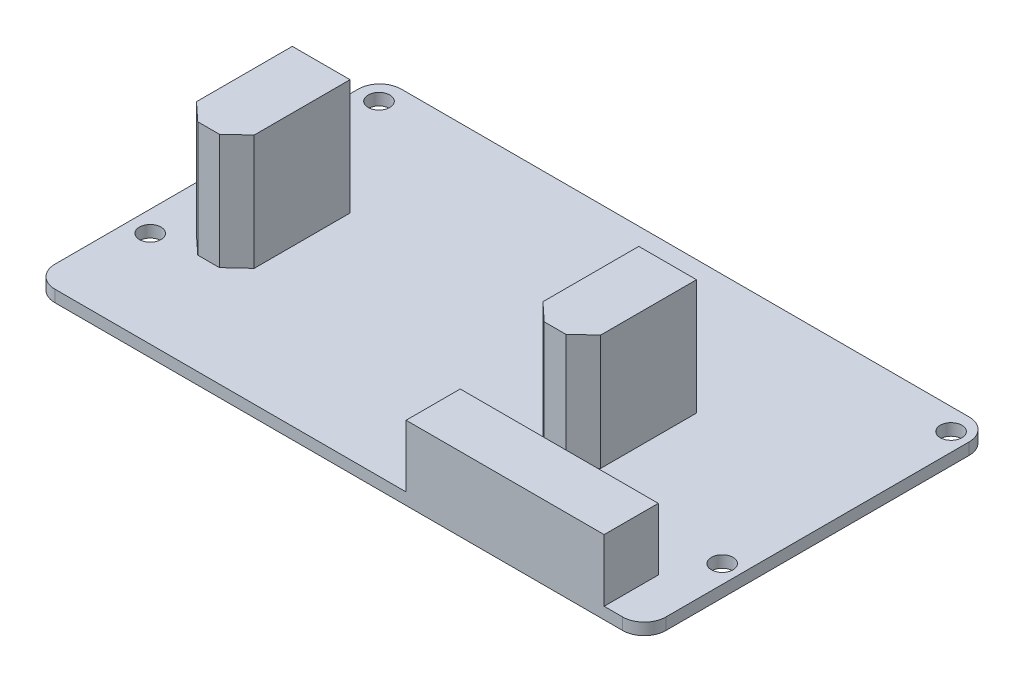
ISO-10303-21;
HEADER;
FILE_DESCRIPTION(('STEP AP214'),'2;1');
FILE_NAME('part.step','',(''),(''),'','','');
FILE_SCHEMA(('AUTOMOTIVE_DESIGN { 1 0 10303 214 1 1 1 1 }'));
ENDSEC;
DATA;
#1=APPLICATION_CONTEXT('core data for automotive mechanical design processes');
#2=APPLICATION_PROTOCOL_DEFINITION('international standard','automotive_design',2000,#1);
#3=PRODUCT_CONTEXT('',#1,'mechanical');
#4=PRODUCT('Part','Part','',(#3));
#5=PRODUCT_RELATED_PRODUCT_CATEGORY('part','',(#4));
#6=PRODUCT_DEFINITION_FORMATION('','',#4);
#7=PRODUCT_DEFINITION_CONTEXT('part definition',#1,'design');
#8=PRODUCT_DEFINITION('design','',#6,#7);
#9=PRODUCT_DEFINITION_SHAPE('','',#8);
#10=(LENGTH_UNIT() NAMED_UNIT(*) SI_UNIT(.MILLI.,.METRE.));
#11=(NAMED_UNIT(*) PLANE_ANGLE_UNIT() SI_UNIT($,.RADIAN.));
#12=(NAMED_UNIT(*) SI_UNIT($,.STERADIAN.) SOLID_ANGLE_UNIT());
#13=UNCERTAINTY_MEASURE_WITH_UNIT(LENGTH_MEASURE(1.E-05),#10,'distance_accuracy_value','');
#14=(GEOMETRIC_REPRESENTATION_CONTEXT(3) GLOBAL_UNCERTAINTY_ASSIGNED_CONTEXT((#13)) GLOBAL_UNIT_ASSIGNED_CONTEXT((#10,
#11,#12)) REPRESENTATION_CONTEXT('',''));
#15=CARTESIAN_POINT('',(0.,0.,0.));
#16=DIRECTION('',(0.,0.,1.));
#17=DIRECTION('',(1.,0.,0.));
#18=AXIS2_PLACEMENT_3D('',#15,#16,#17);
#19=CARTESIAN_POINT('',(0.,1.63,0.));
#20=DIRECTION('',(0.,-1.,0.));
#21=DIRECTION('',(0.,0.,-1.));
#22=AXIS2_PLACEMENT_3D('',#19,#20,#21);
#23=PLANE('',#22);
#24=DIRECTION('',(-1.,0.,0.));
#25=VECTOR('',#24,1.);
#26=CARTESIAN_POINT('',(62.31,1.63,-29.58));
#27=LINE('',#26,#25);
#28=CARTESIAN_POINT('',(62.31,1.63,-29.58));
#29=VERTEX_POINT('',#28);
#30=CARTESIAN_POINT('',(54.31,1.63,-29.58));
#31=VERTEX_POINT('',#30);
#32=EDGE_CURVE('E216',#29,#31,#27,.T.);
#33=ORIENTED_EDGE('',*,*,#32,.F.);
#34=DIRECTION('',(0.,0.,-1.));
#35=VECTOR('',#34,1.);
#36=CARTESIAN_POINT('',(62.31,1.63,-29.58));
#37=LINE('',#36,#35);
#38=CARTESIAN_POINT('',(62.31,1.63,-16.3));
#39=VERTEX_POINT('',#38);
#40=EDGE_CURVE('E229',#39,#29,#37,.T.);
#41=ORIENTED_EDGE('',*,*,#40,.F.);
#42=DIRECTION('',(0.73300231256144,0.,-0.680226146057016));
#43=VECTOR('',#42,1.);
#44=CARTESIAN_POINT('',(59.81,1.63,-13.98));
#45=LINE('',#44,#43);
#46=CARTESIAN_POINT('',(59.81,1.63,-13.98));
#47=VERTEX_POINT('',#46);
#48=EDGE_CURVE('E248',#47,#39,#45,.T.);
#49=ORIENTED_EDGE('',*,*,#48,.F.);
#50=DIRECTION('',(1.,0.,0.));
#51=VECTOR('',#50,1.);
#52=CARTESIAN_POINT('',(58.31,1.63,-13.98));
#53=LINE('',#52,#51);
#54=CARTESIAN_POINT('',(56.81,1.63,-13.98));
#55=VERTEX_POINT('',#54);
#56=EDGE_CURVE('E245',#55,#47,#53,.T.);
#57=ORIENTED_EDGE('',*,*,#56,.F.);
#58=DIRECTION('',(0.733002312561439,0.,0.680226146057017));
#59=VECTOR('',#58,1.);
#60=CARTESIAN_POINT('',(56.81,1.63,-13.98));
#61=LINE('',#60,#59);
#62=CARTESIAN_POINT('',(54.31,1.63,-16.3));
#63=VERTEX_POINT('',#62);
#64=EDGE_CURVE('E242',#63,#55,#61,.T.);
#65=ORIENTED_EDGE('',*,*,#64,.F.);
#66=DIRECTION('',(0.,0.,1.));
#67=VECTOR('',#66,1.);
#68=CARTESIAN_POINT('',(54.31,1.63,-29.58));
#69=LINE('',#68,#67);
#70=EDGE_CURVE('E219',#31,#63,#69,.T.);
#71=ORIENTED_EDGE('',*,*,#70,.F.);
#72=EDGE_LOOP('',(#33,#41,#49,#57,#65,#71));
#73=FACE_BOUND('',#72,.T.);
#74=DIRECTION('',(1.,0.,0.));
#75=VECTOR('',#74,1.);
#76=CARTESIAN_POINT('',(84.65,1.63,0.));
#77=LINE('',#76,#75);
#78=CARTESIAN_POINT('',(3.,1.63,0.));
#79=VERTEX_POINT('',#78);
#80=CARTESIAN_POINT('',(51.65,1.63,0.));
#81=VERTEX_POINT('',#80);
#82=EDGE_CURVE('E323',#79,#81,#77,.T.);
#83=ORIENTED_EDGE('',*,*,#82,.T.);
#84=DIRECTION('',(0.,0.,-1.));
#85=VECTOR('',#84,1.);
#86=CARTESIAN_POINT('',(51.65,1.63,0.));
#87=LINE('',#86,#85);
#88=CARTESIAN_POINT('',(51.65,1.63,-7.5));
#89=VERTEX_POINT('',#88);
#90=EDGE_CURVE('E285',#81,#89,#87,.T.);
#91=ORIENTED_EDGE('',*,*,#90,.T.);
#92=DIRECTION('',(-1.,0.,0.));
#93=VECTOR('',#92,1.);
#94=CARTESIAN_POINT('',(79.09,1.63,-7.5));
#95=LINE('',#94,#93);
#96=CARTESIAN_POINT('',(79.09,1.63,-7.5));
#97=VERTEX_POINT('',#96);
#98=EDGE_CURVE('E295',#97,#89,#95,.T.);
#99=ORIENTED_EDGE('',*,*,#98,.F.);
#100=DIRECTION('',(0.,0.,-1.));
#101=VECTOR('',#100,1.);
#102=CARTESIAN_POINT('',(79.09,1.63,0.));
#103=LINE('',#102,#101);
#104=CARTESIAN_POINT('',(79.09,1.63,0.));
#105=VERTEX_POINT('',#104);
#106=EDGE_CURVE('E274',#105,#97,#103,.T.);
#107=ORIENTED_EDGE('',*,*,#106,.F.);
#108=CARTESIAN_POINT('',(81.65,1.63,0.));
#109=VERTEX_POINT('',#108);
#110=EDGE_CURVE('E326',#105,#109,#77,.T.);
#111=ORIENTED_EDGE('',*,*,#110,.T.);
#112=CARTESIAN_POINT('',(81.65,1.63,-3.));
#113=DIRECTION('',(0.,-1.,0.));
#114=DIRECTION('',(0.,0.,-1.));
#115=AXIS2_PLACEMENT_3D('',#112,#113,#114);
#116=CIRCLE('',#115,3.);
#117=CARTESIAN_POINT('',(84.65,1.63,-3.));
#118=VERTEX_POINT('',#117);
#119=EDGE_CURVE('E369',#109,#118,#116,.F.);
#120=ORIENTED_EDGE('',*,*,#119,.T.);
#121=DIRECTION('',(0.,0.,-1.));
#122=VECTOR('',#121,1.);
#123=CARTESIAN_POINT('',(84.65,1.63,-48.));
#124=LINE('',#123,#122);
#125=CARTESIAN_POINT('',(84.65,1.63,-45.));
#126=VERTEX_POINT('',#125);
#127=EDGE_CURVE('E325',#118,#126,#124,.T.);
#128=ORIENTED_EDGE('',*,*,#127,.T.);
#129=CARTESIAN_POINT('',(81.65,1.63,-45.));
#130=DIRECTION('',(0.,-1.,0.));
#131=DIRECTION('',(0.,0.,-1.));
#132=AXIS2_PLACEMENT_3D('',#129,#130,#131);
#133=CIRCLE('',#132,3.);
#134=CARTESIAN_POINT('',(81.65,1.63,-48.));
#135=VERTEX_POINT('',#134);
#136=EDGE_CURVE('E367',#126,#135,#133,.F.);
#137=ORIENTED_EDGE('',*,*,#136,.T.);
#138=DIRECTION('',(-1.,0.,0.));
#139=VECTOR('',#138,1.);
#140=CARTESIAN_POINT('',(0.,1.63,-48.));
#141=LINE('',#140,#139);
#142=CARTESIAN_POINT('',(3.,1.63,-48.));
#143=VERTEX_POINT('',#142);
#144=EDGE_CURVE('E329',#135,#143,#141,.T.);
#145=ORIENTED_EDGE('',*,*,#144,.T.);
#146=CARTESIAN_POINT('',(3.,1.63,-45.));
#147=DIRECTION('',(0.,-1.,0.));
#148=DIRECTION('',(0.,0.,-1.));
#149=AXIS2_PLACEMENT_3D('',#146,#147,#148);
#150=CIRCLE('',#149,3.);
#151=CARTESIAN_POINT('',(0.,1.63,-45.));
#152=VERTEX_POINT('',#151);
#153=EDGE_CURVE('E365',#143,#152,#150,.F.);
#154=ORIENTED_EDGE('',*,*,#153,.T.);
#155=DIRECTION('',(0.,0.,1.));
#156=VECTOR('',#155,1.);
#157=CARTESIAN_POINT('',(0.,1.63,0.));
#158=LINE('',#157,#156);
#159=CARTESIAN_POINT('',(0.,1.63,-3.));
#160=VERTEX_POINT('',#159);
#161=EDGE_CURVE('E332',#152,#160,#158,.T.);
#162=ORIENTED_EDGE('',*,*,#161,.T.);
#163=CARTESIAN_POINT('',(3.,1.63,-3.));
#164=DIRECTION('',(0.,-1.,0.));
#165=DIRECTION('',(0.,0.,-1.));
#166=AXIS2_PLACEMENT_3D('',#163,#164,#165);
#167=CIRCLE('',#166,3.);
#168=EDGE_CURVE('E371',#160,#79,#167,.F.);
#169=ORIENTED_EDGE('',*,*,#168,.T.);
#170=EDGE_LOOP('',(#83,#91,#99,#107,#111,#120,#128,#137,#145,#154,#162,#169));
#171=FACE_BOUND('',#170,.T.);
#172=CARTESIAN_POINT('',(2.9,1.63,-45.));
#173=DIRECTION('',(0.,1.,0.));
#174=DIRECTION('',(0.,0.,1.));
#175=AXIS2_PLACEMENT_3D('',#172,#173,#174);
#176=CIRCLE('',#175,1.5);
#177=CARTESIAN_POINT('',(2.9,1.63,-43.5));
#178=VERTEX_POINT('',#177);
#179=EDGE_CURVE('E317',#178,#178,#176,.T.);
#180=ORIENTED_EDGE('',*,*,#179,.F.);
#181=EDGE_LOOP('',(#180));
#182=FACE_BOUND('',#181,.T.);
#183=CARTESIAN_POINT('',(2.9,1.63,-13.3));
#184=DIRECTION('',(0.,1.,0.));
#185=DIRECTION('',(0.,0.,1.));
#186=AXIS2_PLACEMENT_3D('',#183,#184,#185);
#187=CIRCLE('',#186,1.5);
#188=CARTESIAN_POINT('',(2.9,1.63,-11.8));
#189=VERTEX_POINT('',#188);
#190=EDGE_CURVE('E311',#189,#189,#187,.T.);
#191=ORIENTED_EDGE('',*,*,#190,.F.);
#192=EDGE_LOOP('',(#191));
#193=FACE_BOUND('',#192,.T.);
#194=CARTESIAN_POINT('',(82.15,1.63,-13.3));
#195=DIRECTION('',(0.,1.,0.));
#196=DIRECTION('',(0.,0.,1.));
#197=AXIS2_PLACEMENT_3D('',#194,#195,#196);
#198=CIRCLE('',#197,1.5);
#199=CARTESIAN_POINT('',(82.15,1.63,-11.8));
#200=VERTEX_POINT('',#199);
#201=EDGE_CURVE('E305',#200,#200,#198,.T.);
#202=ORIENTED_EDGE('',*,*,#201,.F.);
#203=EDGE_LOOP('',(#202));
#204=FACE_BOUND('',#203,.T.);
#205=CARTESIAN_POINT('',(82.15,1.63,-45.));
#206=DIRECTION('',(0.,1.,0.));
#207=DIRECTION('',(0.,0.,1.));
#208=AXIS2_PLACEMENT_3D('',#205,#206,#207);
#209=CIRCLE('',#208,1.5);
#210=CARTESIAN_POINT('',(82.15,1.63,-43.5));
#211=VERTEX_POINT('',#210);
#212=EDGE_CURVE('E299',#211,#211,#209,.T.);
#213=ORIENTED_EDGE('',*,*,#212,.F.);
#214=EDGE_LOOP('',(#213));
#215=FACE_BOUND('',#214,.T.);
#216=DIRECTION('',(0.,0.,-1.));
#217=VECTOR('',#216,1.);
#218=CARTESIAN_POINT('',(14.31,1.63,-29.58));
#219=LINE('',#218,#217);
#220=CARTESIAN_POINT('',(14.31,1.63,-16.3));
#221=VERTEX_POINT('',#220);
#222=CARTESIAN_POINT('',(14.31,1.63,-29.58));
#223=VERTEX_POINT('',#222);
#224=EDGE_CURVE('E215',#221,#223,#219,.T.);
#225=ORIENTED_EDGE('',*,*,#224,.F.);
#226=DIRECTION('',(0.73300231256144,0.,-0.680226146057016));
#227=VECTOR('',#226,1.);
#228=CARTESIAN_POINT('',(11.81,1.63,-13.98));
#229=LINE('',#228,#227);
#230=CARTESIAN_POINT('',(11.81,1.63,-13.98));
#231=VERTEX_POINT('',#230);
#232=EDGE_CURVE('E212',#231,#221,#229,.T.);
#233=ORIENTED_EDGE('',*,*,#232,.F.);
#234=DIRECTION('',(1.,0.,0.));
#235=VECTOR('',#234,1.);
#236=CARTESIAN_POINT('',(10.31,1.63,-13.98));
#237=LINE('',#236,#235);
#238=CARTESIAN_POINT('',(8.80999999999999,1.63,-13.98));
#239=VERTEX_POINT('',#238);
#240=EDGE_CURVE('E503',#239,#231,#237,.T.);
#241=ORIENTED_EDGE('',*,*,#240,.F.);
#242=DIRECTION('',(0.733002312561439,0.,0.680226146057017));
#243=VECTOR('',#242,1.);
#244=CARTESIAN_POINT('',(8.80999999999999,1.63,-13.98));
#245=LINE('',#244,#243);
#246=CARTESIAN_POINT('',(6.31,1.63,-16.3));
#247=VERTEX_POINT('',#246);
#248=EDGE_CURVE('E520',#247,#239,#245,.T.);
#249=ORIENTED_EDGE('',*,*,#248,.F.);
#250=DIRECTION('',(0.,0.,1.));
#251=VECTOR('',#250,1.);
#252=CARTESIAN_POINT('',(6.31,1.63,-29.58));
#253=LINE('',#252,#251);
#254=CARTESIAN_POINT('',(6.31,1.63,-29.58));
#255=VERTEX_POINT('',#254);
#256=EDGE_CURVE('E54',#255,#247,#253,.T.);
#257=ORIENTED_EDGE('',*,*,#256,.F.);
#258=DIRECTION('',(-1.,0.,0.));
#259=VECTOR('',#258,1.);
#260=CARTESIAN_POINT('',(14.31,1.63,-29.58));
#261=LINE('',#260,#259);
#262=EDGE_CURVE('E49',#223,#255,#261,.T.);
#263=ORIENTED_EDGE('',*,*,#262,.F.);
#264=EDGE_LOOP('',(#225,#233,#241,#249,#257,#263));
#265=FACE_BOUND('',#264,.T.);
#266=ADVANCED_FACE('F34',(#73,#171,#182,#193,#204,#215,#265),#23,.F.);
#267=CARTESIAN_POINT('',(0.,0.,0.));
#268=DIRECTION('',(0.,-1.,0.));
#269=DIRECTION('',(0.,0.,-1.));
#270=AXIS2_PLACEMENT_3D('',#267,#268,#269);
#271=PLANE('',#270);
#272=CARTESIAN_POINT('',(82.15,0.,-13.3));
#273=DIRECTION('',(0.,1.,0.));
#274=DIRECTION('',(0.,0.,1.));
#275=AXIS2_PLACEMENT_3D('',#272,#273,#274);
#276=CIRCLE('',#275,1.5);
#277=CARTESIAN_POINT('',(82.15,0.,-11.8));
#278=VERTEX_POINT('',#277);
#279=EDGE_CURVE('E302',#278,#278,#276,.T.);
#280=ORIENTED_EDGE('',*,*,#279,.T.);
#281=EDGE_LOOP('',(#280));
#282=FACE_BOUND('',#281,.T.);
#283=CARTESIAN_POINT('',(2.9,0.,-45.));
#284=DIRECTION('',(0.,1.,0.));
#285=DIRECTION('',(0.,0.,1.));
#286=AXIS2_PLACEMENT_3D('',#283,#284,#285);
#287=CIRCLE('',#286,1.5);
#288=CARTESIAN_POINT('',(2.9,0.,-43.5));
#289=VERTEX_POINT('',#288);
#290=EDGE_CURVE('E314',#289,#289,#287,.T.);
#291=ORIENTED_EDGE('',*,*,#290,.T.);
#292=EDGE_LOOP('',(#291));
#293=FACE_BOUND('',#292,.T.);
#294=DIRECTION('',(1.,0.,0.));
#295=VECTOR('',#294,1.);
#296=CARTESIAN_POINT('',(84.65,0.,0.));
#297=LINE('',#296,#295);
#298=CARTESIAN_POINT('',(3.,0.,0.));
#299=VERTEX_POINT('',#298);
#300=CARTESIAN_POINT('',(81.65,0.,0.));
#301=VERTEX_POINT('',#300);
#302=EDGE_CURVE('E320',#299,#301,#297,.T.);
#303=ORIENTED_EDGE('',*,*,#302,.F.);
#304=CARTESIAN_POINT('',(3.,0.,-3.));
#305=DIRECTION('',(0.,-1.,0.));
#306=DIRECTION('',(0.,0.,-1.));
#307=AXIS2_PLACEMENT_3D('',#304,#305,#306);
#308=CIRCLE('',#307,3.);
#309=CARTESIAN_POINT('',(0.,0.,-3.));
#310=VERTEX_POINT('',#309);
#311=EDGE_CURVE('E358',#299,#310,#308,.T.);
#312=ORIENTED_EDGE('',*,*,#311,.T.);
#313=DIRECTION('',(0.,0.,1.));
#314=VECTOR('',#313,1.);
#315=CARTESIAN_POINT('',(0.,0.,0.));
#316=LINE('',#315,#314);
#317=CARTESIAN_POINT('',(0.,0.,-45.));
#318=VERTEX_POINT('',#317);
#319=EDGE_CURVE('E344',#318,#310,#316,.T.);
#320=ORIENTED_EDGE('',*,*,#319,.F.);
#321=CARTESIAN_POINT('',(3.,0.,-45.));
#322=DIRECTION('',(0.,-1.,0.));
#323=DIRECTION('',(0.,0.,-1.));
#324=AXIS2_PLACEMENT_3D('',#321,#322,#323);
#325=CIRCLE('',#324,3.);
#326=CARTESIAN_POINT('',(3.,0.,-48.));
#327=VERTEX_POINT('',#326);
#328=EDGE_CURVE('E352',#318,#327,#325,.T.);
#329=ORIENTED_EDGE('',*,*,#328,.T.);
#330=DIRECTION('',(-1.,0.,0.));
#331=VECTOR('',#330,1.);
#332=CARTESIAN_POINT('',(0.,0.,-48.));
#333=LINE('',#332,#331);
#334=CARTESIAN_POINT('',(81.65,0.,-48.));
#335=VERTEX_POINT('',#334);
#336=EDGE_CURVE('E341',#335,#327,#333,.T.);
#337=ORIENTED_EDGE('',*,*,#336,.F.);
#338=CARTESIAN_POINT('',(81.65,0.,-45.));
#339=DIRECTION('',(0.,-1.,0.));
#340=DIRECTION('',(0.,0.,-1.));
#341=AXIS2_PLACEMENT_3D('',#338,#339,#340);
#342=CIRCLE('',#341,3.);
#343=CARTESIAN_POINT('',(84.65,0.,-45.));
#344=VERTEX_POINT('',#343);
#345=EDGE_CURVE('E354',#335,#344,#342,.T.);
#346=ORIENTED_EDGE('',*,*,#345,.T.);
#347=DIRECTION('',(0.,0.,-1.));
#348=VECTOR('',#347,1.);
#349=CARTESIAN_POINT('',(84.65,0.,-48.));
#350=LINE('',#349,#348);
#351=CARTESIAN_POINT('',(84.65,0.,-3.));
#352=VERTEX_POINT('',#351);
#353=EDGE_CURVE('E338',#352,#344,#350,.T.);
#354=ORIENTED_EDGE('',*,*,#353,.F.);
#355=CARTESIAN_POINT('',(81.65,0.,-3.));
#356=DIRECTION('',(0.,-1.,0.));
#357=DIRECTION('',(0.,0.,-1.));
#358=AXIS2_PLACEMENT_3D('',#355,#356,#357);
#359=CIRCLE('',#358,3.);
#360=EDGE_CURVE('E356',#352,#301,#359,.T.);
#361=ORIENTED_EDGE('',*,*,#360,.T.);
#362=EDGE_LOOP('',(#303,#312,#320,#329,#337,#346,#354,#361));
#363=FACE_BOUND('',#362,.T.);
#364=CARTESIAN_POINT('',(2.9,0.,-13.3));
#365=DIRECTION('',(0.,1.,0.));
#366=DIRECTION('',(0.,0.,1.));
#367=AXIS2_PLACEMENT_3D('',#364,#365,#366);
#368=CIRCLE('',#367,1.5);
#369=CARTESIAN_POINT('',(2.9,0.,-11.8));
#370=VERTEX_POINT('',#369);
#371=EDGE_CURVE('E308',#370,#370,#368,.T.);
#372=ORIENTED_EDGE('',*,*,#371,.T.);
#373=EDGE_LOOP('',(#372));
#374=FACE_BOUND('',#373,.T.);
#375=CARTESIAN_POINT('',(82.15,0.,-45.));
#376=DIRECTION('',(0.,1.,0.));
#377=DIRECTION('',(0.,0.,1.));
#378=AXIS2_PLACEMENT_3D('',#375,#376,#377);
#379=CIRCLE('',#378,1.5);
#380=CARTESIAN_POINT('',(82.15,0.,-43.5));
#381=VERTEX_POINT('',#380);
#382=EDGE_CURVE('E298',#381,#381,#379,.T.);
#383=ORIENTED_EDGE('',*,*,#382,.T.);
#384=EDGE_LOOP('',(#383));
#385=FACE_BOUND('',#384,.T.);
#386=ADVANCED_FACE('F396',(#282,#293,#363,#374,#385),#271,.T.);
#387=CARTESIAN_POINT('',(84.65,1.63,0.));
#388=DIRECTION('',(0.,0.,-1.));
#389=DIRECTION('',(-1.,0.,0.));
#390=AXIS2_PLACEMENT_3D('',#387,#388,#389);
#391=PLANE('',#390);
#392=ORIENTED_EDGE('',*,*,#82,.F.);
#393=DIRECTION('',(0.,-1.,0.));
#394=VECTOR('',#393,1.);
#395=CARTESIAN_POINT('',(3.,1.63,0.));
#396=LINE('',#395,#394);
#397=EDGE_CURVE('E349',#79,#299,#396,.T.);
#398=ORIENTED_EDGE('',*,*,#397,.T.);
#399=ORIENTED_EDGE('',*,*,#302,.T.);
#400=DIRECTION('',(0.,-1.,0.));
#401=VECTOR('',#400,1.);
#402=CARTESIAN_POINT('',(81.65,1.63,0.));
#403=LINE('',#402,#401);
#404=EDGE_CURVE('E335',#301,#109,#403,.F.);
#405=ORIENTED_EDGE('',*,*,#404,.T.);
#406=ORIENTED_EDGE('',*,*,#110,.F.);
#407=DIRECTION('',(0.,-1.,0.));
#408=VECTOR('',#407,1.);
#409=CARTESIAN_POINT('',(79.09,10.23,0.));
#410=LINE('',#409,#408);
#411=CARTESIAN_POINT('',(79.09,10.23,0.));
#412=VERTEX_POINT('',#411);
#413=EDGE_CURVE('E271',#412,#105,#410,.T.);
#414=ORIENTED_EDGE('',*,*,#413,.F.);
#415=DIRECTION('',(-1.,0.,0.));
#416=VECTOR('',#415,1.);
#417=CARTESIAN_POINT('',(79.09,10.23,0.));
#418=LINE('',#417,#416);
#419=CARTESIAN_POINT('',(51.65,10.23,0.));
#420=VERTEX_POINT('',#419);
#421=EDGE_CURVE('E282',#412,#420,#418,.T.);
#422=ORIENTED_EDGE('',*,*,#421,.T.);
#423=DIRECTION('',(0.,-1.,0.));
#424=VECTOR('',#423,1.);
#425=CARTESIAN_POINT('',(51.65,10.23,0.));
#426=LINE('',#425,#424);
#427=EDGE_CURVE('E270',#420,#81,#426,.T.);
#428=ORIENTED_EDGE('',*,*,#427,.T.);
#429=EDGE_LOOP('',(#392,#398,#399,#405,#406,#414,#422,#428));
#430=FACE_BOUND('',#429,.T.);
#431=ADVANCED_FACE('F404',(#430),#391,.F.);
#432=CARTESIAN_POINT('',(84.65,1.63,-48.));
#433=DIRECTION('',(-1.,0.,0.));
#434=DIRECTION('',(0.,0.,1.));
#435=AXIS2_PLACEMENT_3D('',#432,#433,#434);
#436=PLANE('',#435);
#437=ORIENTED_EDGE('',*,*,#127,.F.);
#438=DIRECTION('',(0.,-1.,0.));
#439=VECTOR('',#438,1.);
#440=CARTESIAN_POINT('',(84.65,1.63,-3.));
#441=LINE('',#440,#439);
#442=EDGE_CURVE('E375',#118,#352,#441,.T.);
#443=ORIENTED_EDGE('',*,*,#442,.T.);
#444=ORIENTED_EDGE('',*,*,#353,.T.);
#445=DIRECTION('',(0.,-1.,0.));
#446=VECTOR('',#445,1.);
#447=CARTESIAN_POINT('',(84.65,1.63,-45.));
#448=LINE('',#447,#446);
#449=EDGE_CURVE('E373',#344,#126,#448,.F.);
#450=ORIENTED_EDGE('',*,*,#449,.T.);
#451=EDGE_LOOP('',(#437,#443,#444,#450));
#452=FACE_BOUND('',#451,.T.);
#453=ADVANCED_FACE('F430',(#452),#436,.F.);
#454=CARTESIAN_POINT('',(0.,1.63,-48.));
#455=DIRECTION('',(0.,0.,1.));
#456=DIRECTION('',(1.,0.,0.));
#457=AXIS2_PLACEMENT_3D('',#454,#455,#456);
#458=PLANE('',#457);
#459=ORIENTED_EDGE('',*,*,#144,.F.);
#460=DIRECTION('',(0.,-1.,0.));
#461=VECTOR('',#460,1.);
#462=CARTESIAN_POINT('',(81.65,1.63,-48.));
#463=LINE('',#462,#461);
#464=EDGE_CURVE('E11',#135,#335,#463,.T.);
#465=ORIENTED_EDGE('',*,*,#464,.T.);
#466=ORIENTED_EDGE('',*,*,#336,.T.);
#467=DIRECTION('',(0.,-1.,0.));
#468=VECTOR('',#467,1.);
#469=CARTESIAN_POINT('',(3.,1.63,-48.));
#470=LINE('',#469,#468);
#471=EDGE_CURVE('E42',#327,#143,#470,.F.);
#472=ORIENTED_EDGE('',*,*,#471,.T.);
#473=EDGE_LOOP('',(#459,#465,#466,#472));
#474=FACE_BOUND('',#473,.T.);
#475=ADVANCED_FACE('F380',(#474),#458,.F.);
#476=CARTESIAN_POINT('',(0.,1.63,0.));
#477=DIRECTION('',(1.,0.,0.));
#478=DIRECTION('',(0.,0.,-1.));
#479=AXIS2_PLACEMENT_3D('',#476,#477,#478);
#480=PLANE('',#479);
#481=ORIENTED_EDGE('',*,*,#319,.T.);
#482=DIRECTION('',(0.,-1.,0.));
#483=VECTOR('',#482,1.);
#484=CARTESIAN_POINT('',(0.,1.63,-3.));
#485=LINE('',#484,#483);
#486=EDGE_CURVE('E363',#310,#160,#485,.F.);
#487=ORIENTED_EDGE('',*,*,#486,.T.);
#488=ORIENTED_EDGE('',*,*,#161,.F.);
#489=DIRECTION('',(0.,-1.,0.));
#490=VECTOR('',#489,1.);
#491=CARTESIAN_POINT('',(0.,1.63,-45.));
#492=LINE('',#491,#490);
#493=EDGE_CURVE('E360',#152,#318,#492,.T.);
#494=ORIENTED_EDGE('',*,*,#493,.T.);
#495=EDGE_LOOP('',(#481,#487,#488,#494));
#496=FACE_BOUND('',#495,.T.);
#497=ADVANCED_FACE('F392',(#496),#480,.F.);
#498=CARTESIAN_POINT('',(2.9,1.63,-45.));
#499=DIRECTION('',(0.,-1.,0.));
#500=DIRECTION('',(0.,0.,-1.));
#501=AXIS2_PLACEMENT_3D('',#498,#499,#500);
#502=CYLINDRICAL_SURFACE('',#501,1.5);
#503=ORIENTED_EDGE('',*,*,#179,.T.);
#504=EDGE_LOOP('',(#503));
#505=FACE_BOUND('',#504,.T.);
#506=ORIENTED_EDGE('',*,*,#290,.F.);
#507=EDGE_LOOP('',(#506));
#508=FACE_BOUND('',#507,.T.);
#509=ADVANCED_FACE('F450',(#505,#508),#502,.F.);
#510=CARTESIAN_POINT('',(2.9,1.63,-13.3));
#511=DIRECTION('',(0.,-1.,0.));
#512=DIRECTION('',(0.,0.,-1.));
#513=AXIS2_PLACEMENT_3D('',#510,#511,#512);
#514=CYLINDRICAL_SURFACE('',#513,1.5);
#515=ORIENTED_EDGE('',*,*,#190,.T.);
#516=EDGE_LOOP('',(#515));
#517=FACE_BOUND('',#516,.T.);
#518=ORIENTED_EDGE('',*,*,#371,.F.);
#519=EDGE_LOOP('',(#518));
#520=FACE_BOUND('',#519,.T.);
#521=ADVANCED_FACE('F472',(#517,#520),#514,.F.);
#522=CARTESIAN_POINT('',(82.15,1.63,-13.3));
#523=DIRECTION('',(0.,-1.,0.));
#524=DIRECTION('',(0.,0.,-1.));
#525=AXIS2_PLACEMENT_3D('',#522,#523,#524);
#526=CYLINDRICAL_SURFACE('',#525,1.5);
#527=ORIENTED_EDGE('',*,*,#201,.T.);
#528=EDGE_LOOP('',(#527));
#529=FACE_BOUND('',#528,.T.);
#530=ORIENTED_EDGE('',*,*,#279,.F.);
#531=EDGE_LOOP('',(#530));
#532=FACE_BOUND('',#531,.T.);
#533=ADVANCED_FACE('F466',(#529,#532),#526,.F.);
#534=CARTESIAN_POINT('',(82.15,1.63,-45.));
#535=DIRECTION('',(0.,-1.,0.));
#536=DIRECTION('',(0.,0.,-1.));
#537=AXIS2_PLACEMENT_3D('',#534,#535,#536);
#538=CYLINDRICAL_SURFACE('',#537,1.5);
#539=ORIENTED_EDGE('',*,*,#212,.T.);
#540=EDGE_LOOP('',(#539));
#541=FACE_BOUND('',#540,.T.);
#542=ORIENTED_EDGE('',*,*,#382,.F.);
#543=EDGE_LOOP('',(#542));
#544=FACE_BOUND('',#543,.T.);
#545=ADVANCED_FACE('F462',(#541,#544),#538,.F.);
#546=CARTESIAN_POINT('',(3.,1.63,-3.));
#547=DIRECTION('',(0.,-1.,0.));
#548=DIRECTION('',(0.,0.,-1.));
#549=AXIS2_PLACEMENT_3D('',#546,#547,#548);
#550=CYLINDRICAL_SURFACE('',#549,3.);
#551=ORIENTED_EDGE('',*,*,#168,.F.);
#552=ORIENTED_EDGE('',*,*,#486,.F.);
#553=ORIENTED_EDGE('',*,*,#311,.F.);
#554=ORIENTED_EDGE('',*,*,#397,.F.);
#555=EDGE_LOOP('',(#551,#552,#553,#554));
#556=FACE_BOUND('',#555,.T.);
#557=ADVANCED_FACE('F401',(#556),#550,.T.);
#558=CARTESIAN_POINT('',(81.65,1.63,-3.));
#559=DIRECTION('',(0.,-1.,0.));
#560=DIRECTION('',(0.,0.,-1.));
#561=AXIS2_PLACEMENT_3D('',#558,#559,#560);
#562=CYLINDRICAL_SURFACE('',#561,3.);
#563=ORIENTED_EDGE('',*,*,#119,.F.);
#564=ORIENTED_EDGE('',*,*,#404,.F.);
#565=ORIENTED_EDGE('',*,*,#360,.F.);
#566=ORIENTED_EDGE('',*,*,#442,.F.);
#567=EDGE_LOOP('',(#563,#564,#565,#566));
#568=FACE_BOUND('',#567,.T.);
#569=ADVANCED_FACE('F427',(#568),#562,.T.);
#570=CARTESIAN_POINT('',(81.65,1.63,-45.));
#571=DIRECTION('',(0.,-1.,0.));
#572=DIRECTION('',(0.,0.,-1.));
#573=AXIS2_PLACEMENT_3D('',#570,#571,#572);
#574=CYLINDRICAL_SURFACE('',#573,3.);
#575=ORIENTED_EDGE('',*,*,#136,.F.);
#576=ORIENTED_EDGE('',*,*,#449,.F.);
#577=ORIENTED_EDGE('',*,*,#345,.F.);
#578=ORIENTED_EDGE('',*,*,#464,.F.);
#579=EDGE_LOOP('',(#575,#576,#577,#578));
#580=FACE_BOUND('',#579,.T.);
#581=ADVANCED_FACE('F434',(#580),#574,.T.);
#582=CARTESIAN_POINT('',(3.,1.63,-45.));
#583=DIRECTION('',(0.,-1.,0.));
#584=DIRECTION('',(0.,0.,-1.));
#585=AXIS2_PLACEMENT_3D('',#582,#583,#584);
#586=CYLINDRICAL_SURFACE('',#585,3.);
#587=ORIENTED_EDGE('',*,*,#153,.F.);
#588=ORIENTED_EDGE('',*,*,#471,.F.);
#589=ORIENTED_EDGE('',*,*,#328,.F.);
#590=ORIENTED_EDGE('',*,*,#493,.F.);
#591=EDGE_LOOP('',(#587,#588,#589,#590));
#592=FACE_BOUND('',#591,.T.);
#593=ADVANCED_FACE('F36',(#592),#586,.T.);
#594=CARTESIAN_POINT('',(79.09,1.63,-7.5));
#595=DIRECTION('',(0.,0.,1.));
#596=DIRECTION('',(1.,0.,0.));
#597=AXIS2_PLACEMENT_3D('',#594,#595,#596);
#598=PLANE('',#597);
#599=DIRECTION('',(0.,1.,0.));
#600=VECTOR('',#599,1.);
#601=CARTESIAN_POINT('',(51.65,1.63,-7.5));
#602=LINE('',#601,#600);
#603=CARTESIAN_POINT('',(51.65,10.23,-7.5));
#604=VERTEX_POINT('',#603);
#605=EDGE_CURVE('E287',#89,#604,#602,.T.);
#606=ORIENTED_EDGE('',*,*,#605,.T.);
#607=DIRECTION('',(-1.,0.,0.));
#608=VECTOR('',#607,1.);
#609=CARTESIAN_POINT('',(79.09,10.23,-7.5));
#610=LINE('',#609,#608);
#611=CARTESIAN_POINT('',(79.09,10.23,-7.5));
#612=VERTEX_POINT('',#611);
#613=EDGE_CURVE('E292',#612,#604,#610,.T.);
#614=ORIENTED_EDGE('',*,*,#613,.F.);
#615=DIRECTION('',(0.,1.,0.));
#616=VECTOR('',#615,1.);
#617=CARTESIAN_POINT('',(79.09,1.63,-7.5));
#618=LINE('',#617,#616);
#619=EDGE_CURVE('E278',#97,#612,#618,.T.);
#620=ORIENTED_EDGE('',*,*,#619,.F.);
#621=ORIENTED_EDGE('',*,*,#98,.T.);
#622=EDGE_LOOP('',(#606,#614,#620,#621));
#623=FACE_BOUND('',#622,.T.);
#624=ADVANCED_FACE('F414',(#623),#598,.F.);
#625=CARTESIAN_POINT('',(79.09,10.23,-7.5));
#626=DIRECTION('',(0.,-1.,0.));
#627=DIRECTION('',(0.,0.,-1.));
#628=AXIS2_PLACEMENT_3D('',#625,#626,#627);
#629=PLANE('',#628);
#630=DIRECTION('',(0.,0.,1.));
#631=VECTOR('',#630,1.);
#632=CARTESIAN_POINT('',(51.65,10.23,-7.5));
#633=LINE('',#632,#631);
#634=EDGE_CURVE('E275',#604,#420,#633,.T.);
#635=ORIENTED_EDGE('',*,*,#634,.T.);
#636=ORIENTED_EDGE('',*,*,#421,.F.);
#637=DIRECTION('',(0.,0.,1.));
#638=VECTOR('',#637,1.);
#639=CARTESIAN_POINT('',(79.09,10.23,-7.5));
#640=LINE('',#639,#638);
#641=EDGE_CURVE('E280',#612,#412,#640,.T.);
#642=ORIENTED_EDGE('',*,*,#641,.F.);
#643=ORIENTED_EDGE('',*,*,#613,.T.);
#644=EDGE_LOOP('',(#635,#636,#642,#643));
#645=FACE_BOUND('',#644,.T.);
#646=ADVANCED_FACE('F418',(#645),#629,.F.);
#647=CARTESIAN_POINT('',(79.09,0.,0.));
#648=DIRECTION('',(1.,0.,0.));
#649=DIRECTION('',(0.,0.,-1.));
#650=AXIS2_PLACEMENT_3D('',#647,#648,#649);
#651=PLANE('',#650);
#652=ORIENTED_EDGE('',*,*,#413,.T.);
#653=ORIENTED_EDGE('',*,*,#106,.T.);
#654=ORIENTED_EDGE('',*,*,#619,.T.);
#655=ORIENTED_EDGE('',*,*,#641,.T.);
#656=EDGE_LOOP('',(#652,#653,#654,#655));
#657=FACE_BOUND('',#656,.T.);
#658=ADVANCED_FACE('F422',(#657),#651,.T.);
#659=CARTESIAN_POINT('',(51.65,0.,0.));
#660=DIRECTION('',(1.,0.,0.));
#661=DIRECTION('',(0.,0.,-1.));
#662=AXIS2_PLACEMENT_3D('',#659,#660,#661);
#663=PLANE('',#662);
#664=ORIENTED_EDGE('',*,*,#427,.F.);
#665=ORIENTED_EDGE('',*,*,#634,.F.);
#666=ORIENTED_EDGE('',*,*,#605,.F.);
#667=ORIENTED_EDGE('',*,*,#90,.F.);
#668=EDGE_LOOP('',(#664,#665,#666,#667));
#669=FACE_BOUND('',#668,.T.);
#670=ADVANCED_FACE('F410',(#669),#663,.F.);
#671=CARTESIAN_POINT('',(62.31,17.63,-29.58));
#672=DIRECTION('',(0.,0.,1.));
#673=DIRECTION('',(1.,0.,0.));
#674=AXIS2_PLACEMENT_3D('',#671,#672,#673);
#675=PLANE('',#674);
#676=ORIENTED_EDGE('',*,*,#32,.T.);
#677=DIRECTION('',(0.,-1.,0.));
#678=VECTOR('',#677,1.);
#679=CARTESIAN_POINT('',(54.31,17.63,-29.58));
#680=LINE('',#679,#678);
#681=CARTESIAN_POINT('',(54.31,17.63,-29.58));
#682=VERTEX_POINT('',#681);
#683=EDGE_CURVE('E267',#682,#31,#680,.T.);
#684=ORIENTED_EDGE('',*,*,#683,.F.);
#685=DIRECTION('',(-1.,0.,0.));
#686=VECTOR('',#685,1.);
#687=CARTESIAN_POINT('',(62.31,17.63,-29.58));
#688=LINE('',#687,#686);
#689=CARTESIAN_POINT('',(62.31,17.63,-29.58));
#690=VERTEX_POINT('',#689);
#691=EDGE_CURVE('E225',#690,#682,#688,.T.);
#692=ORIENTED_EDGE('',*,*,#691,.F.);
#693=DIRECTION('',(0.,-1.,0.));
#694=VECTOR('',#693,1.);
#695=CARTESIAN_POINT('',(62.31,17.63,-29.58));
#696=LINE('',#695,#694);
#697=EDGE_CURVE('E238',#690,#29,#696,.T.);
#698=ORIENTED_EDGE('',*,*,#697,.T.);
#699=EDGE_LOOP('',(#676,#684,#692,#698));
#700=FACE_BOUND('',#699,.T.);
#701=ADVANCED_FACE('F572',(#700),#675,.F.);
#702=CARTESIAN_POINT('',(54.31,17.63,-29.58));
#703=DIRECTION('',(1.,0.,0.));
#704=DIRECTION('',(0.,0.,-1.));
#705=AXIS2_PLACEMENT_3D('',#702,#703,#704);
#706=PLANE('',#705);
#707=ORIENTED_EDGE('',*,*,#70,.T.);
#708=DIRECTION('',(0.,-1.,0.));
#709=VECTOR('',#708,1.);
#710=CARTESIAN_POINT('',(54.31,17.63,-16.3));
#711=LINE('',#710,#709);
#712=CARTESIAN_POINT('',(54.31,17.63,-16.3));
#713=VERTEX_POINT('',#712);
#714=EDGE_CURVE('E264',#713,#63,#711,.T.);
#715=ORIENTED_EDGE('',*,*,#714,.F.);
#716=DIRECTION('',(0.,0.,1.));
#717=VECTOR('',#716,1.);
#718=CARTESIAN_POINT('',(54.31,17.63,-29.58));
#719=LINE('',#718,#717);
#720=EDGE_CURVE('E228',#682,#713,#719,.T.);
#721=ORIENTED_EDGE('',*,*,#720,.F.);
#722=ORIENTED_EDGE('',*,*,#683,.T.);
#723=EDGE_LOOP('',(#707,#715,#721,#722));
#724=FACE_BOUND('',#723,.T.);
#725=ADVANCED_FACE('F568',(#724),#706,.F.);
#726=CARTESIAN_POINT('',(56.81,17.63,-13.98));
#727=DIRECTION('',(0.680226146057017,0.,-0.73300231256144));
#728=DIRECTION('',(-0.73300231256144,0.,-0.680226146057017));
#729=AXIS2_PLACEMENT_3D('',#726,#727,#728);
#730=PLANE('',#729);
#731=ORIENTED_EDGE('',*,*,#64,.T.);
#732=DIRECTION('',(0.,-1.,0.));
#733=VECTOR('',#732,1.);
#734=CARTESIAN_POINT('',(56.81,17.63,-13.98));
#735=LINE('',#734,#733);
#736=CARTESIAN_POINT('',(56.81,17.63,-13.98));
#737=VERTEX_POINT('',#736);
#738=EDGE_CURVE('E261',#737,#55,#735,.T.);
#739=ORIENTED_EDGE('',*,*,#738,.F.);
#740=DIRECTION('',(0.733002312561439,0.,0.680226146057017));
#741=VECTOR('',#740,1.);
#742=CARTESIAN_POINT('',(56.81,17.63,-13.98));
#743=LINE('',#742,#741);
#744=EDGE_CURVE('E231',#713,#737,#743,.T.);
#745=ORIENTED_EDGE('',*,*,#744,.F.);
#746=ORIENTED_EDGE('',*,*,#714,.T.);
#747=EDGE_LOOP('',(#731,#739,#745,#746));
#748=FACE_BOUND('',#747,.T.);
#749=ADVANCED_FACE('F564',(#748),#730,.F.);
#750=CARTESIAN_POINT('',(58.31,17.63,-13.98));
#751=DIRECTION('',(0.,0.,-1.));
#752=DIRECTION('',(-1.,0.,0.));
#753=AXIS2_PLACEMENT_3D('',#750,#751,#752);
#754=PLANE('',#753);
#755=ORIENTED_EDGE('',*,*,#56,.T.);
#756=DIRECTION('',(0.,-1.,0.));
#757=VECTOR('',#756,1.);
#758=CARTESIAN_POINT('',(59.81,17.63,-13.98));
#759=LINE('',#758,#757);
#760=CARTESIAN_POINT('',(59.81,17.63,-13.98));
#761=VERTEX_POINT('',#760);
#762=EDGE_CURVE('E258',#761,#47,#759,.T.);
#763=ORIENTED_EDGE('',*,*,#762,.F.);
#764=DIRECTION('',(1.,0.,0.));
#765=VECTOR('',#764,1.);
#766=CARTESIAN_POINT('',(58.31,17.63,-13.98));
#767=LINE('',#766,#765);
#768=EDGE_CURVE('E233',#737,#761,#767,.T.);
#769=ORIENTED_EDGE('',*,*,#768,.F.);
#770=ORIENTED_EDGE('',*,*,#738,.T.);
#771=EDGE_LOOP('',(#755,#763,#769,#770));
#772=FACE_BOUND('',#771,.T.);
#773=ADVANCED_FACE('F560',(#772),#754,.F.);
#774=CARTESIAN_POINT('',(59.81,17.63,-13.98));
#775=DIRECTION('',(-0.680226146057016,0.,-0.73300231256144));
#776=DIRECTION('',(-0.73300231256144,0.,0.680226146057016));
#777=AXIS2_PLACEMENT_3D('',#774,#775,#776);
#778=PLANE('',#777);
#779=ORIENTED_EDGE('',*,*,#48,.T.);
#780=DIRECTION('',(0.,-1.,0.));
#781=VECTOR('',#780,1.);
#782=CARTESIAN_POINT('',(62.31,17.63,-16.3));
#783=LINE('',#782,#781);
#784=CARTESIAN_POINT('',(62.31,17.63,-16.3));
#785=VERTEX_POINT('',#784);
#786=EDGE_CURVE('E255',#785,#39,#783,.T.);
#787=ORIENTED_EDGE('',*,*,#786,.F.);
#788=DIRECTION('',(0.73300231256144,0.,-0.680226146057016));
#789=VECTOR('',#788,1.);
#790=CARTESIAN_POINT('',(59.81,17.63,-13.98));
#791=LINE('',#790,#789);
#792=EDGE_CURVE('E235',#761,#785,#791,.T.);
#793=ORIENTED_EDGE('',*,*,#792,.F.);
#794=ORIENTED_EDGE('',*,*,#762,.T.);
#795=EDGE_LOOP('',(#779,#787,#793,#794));
#796=FACE_BOUND('',#795,.T.);
#797=ADVANCED_FACE('F556',(#796),#778,.F.);
#798=CARTESIAN_POINT('',(62.31,17.63,-29.58));
#799=DIRECTION('',(-1.,0.,0.));
#800=DIRECTION('',(0.,0.,1.));
#801=AXIS2_PLACEMENT_3D('',#798,#799,#800);
#802=PLANE('',#801);
#803=ORIENTED_EDGE('',*,*,#40,.T.);
#804=ORIENTED_EDGE('',*,*,#697,.F.);
#805=DIRECTION('',(0.,0.,-1.));
#806=VECTOR('',#805,1.);
#807=CARTESIAN_POINT('',(62.31,17.63,-29.58));
#808=LINE('',#807,#806);
#809=EDGE_CURVE('E237',#785,#690,#808,.T.);
#810=ORIENTED_EDGE('',*,*,#809,.F.);
#811=ORIENTED_EDGE('',*,*,#786,.T.);
#812=EDGE_LOOP('',(#803,#804,#810,#811));
#813=FACE_BOUND('',#812,.T.);
#814=ADVANCED_FACE('F552',(#813),#802,.F.);
#815=CARTESIAN_POINT('',(0.,17.63,0.));
#816=DIRECTION('',(0.,1.,0.));
#817=DIRECTION('',(0.,0.,1.));
#818=AXIS2_PLACEMENT_3D('',#815,#816,#817);
#819=PLANE('',#818);
#820=ORIENTED_EDGE('',*,*,#691,.T.);
#821=ORIENTED_EDGE('',*,*,#720,.T.);
#822=ORIENTED_EDGE('',*,*,#744,.T.);
#823=ORIENTED_EDGE('',*,*,#768,.T.);
#824=ORIENTED_EDGE('',*,*,#792,.T.);
#825=ORIENTED_EDGE('',*,*,#809,.T.);
#826=EDGE_LOOP('',(#820,#821,#822,#823,#824,#825));
#827=FACE_BOUND('',#826,.T.);
#828=ADVANCED_FACE('F549',(#827),#819,.T.);
#829=CARTESIAN_POINT('',(14.31,17.63,-29.58));
#830=DIRECTION('',(-1.,0.,0.));
#831=DIRECTION('',(0.,0.,1.));
#832=AXIS2_PLACEMENT_3D('',#829,#830,#831);
#833=PLANE('',#832);
#834=ORIENTED_EDGE('',*,*,#224,.T.);
#835=DIRECTION('',(0.,-1.,0.));
#836=VECTOR('',#835,1.);
#837=CARTESIAN_POINT('',(14.31,17.63,-29.58));
#838=LINE('',#837,#836);
#839=CARTESIAN_POINT('',(14.31,17.63,-29.58));
#840=VERTEX_POINT('',#839);
#841=EDGE_CURVE('E196',#840,#223,#838,.T.);
#842=ORIENTED_EDGE('',*,*,#841,.F.);
#843=DIRECTION('',(0.,0.,-1.));
#844=VECTOR('',#843,1.);
#845=CARTESIAN_POINT('',(14.31,17.63,-29.58));
#846=LINE('',#845,#844);
#847=CARTESIAN_POINT('',(14.31,17.63,-16.3));
#848=VERTEX_POINT('',#847);
#849=EDGE_CURVE('E203',#848,#840,#846,.T.);
#850=ORIENTED_EDGE('',*,*,#849,.F.);
#851=DIRECTION('',(0.,-1.,0.));
#852=VECTOR('',#851,1.);
#853=CARTESIAN_POINT('',(14.31,17.63,-16.3));
#854=LINE('',#853,#852);
#855=EDGE_CURVE('E500',#848,#221,#854,.T.);
#856=ORIENTED_EDGE('',*,*,#855,.T.);
#857=EDGE_LOOP('',(#834,#842,#850,#856));
#858=FACE_BOUND('',#857,.T.);
#859=ADVANCED_FACE('F214',(#858),#833,.F.);
#860=CARTESIAN_POINT('',(14.31,17.63,-29.58));
#861=DIRECTION('',(0.,0.,1.));
#862=DIRECTION('',(1.,0.,0.));
#863=AXIS2_PLACEMENT_3D('',#860,#861,#862);
#864=PLANE('',#863);
#865=ORIENTED_EDGE('',*,*,#262,.T.);
#866=DIRECTION('',(0.,-1.,0.));
#867=VECTOR('',#866,1.);
#868=CARTESIAN_POINT('',(6.31,17.63,-29.58));
#869=LINE('',#868,#867);
#870=CARTESIAN_POINT('',(6.31,17.63,-29.58));
#871=VERTEX_POINT('',#870);
#872=EDGE_CURVE('E199',#871,#255,#869,.T.);
#873=ORIENTED_EDGE('',*,*,#872,.F.);
#874=DIRECTION('',(-1.,0.,0.));
#875=VECTOR('',#874,1.);
#876=CARTESIAN_POINT('',(14.31,17.63,-29.58));
#877=LINE('',#876,#875);
#878=EDGE_CURVE('E192',#840,#871,#877,.T.);
#879=ORIENTED_EDGE('',*,*,#878,.F.);
#880=ORIENTED_EDGE('',*,*,#841,.T.);
#881=EDGE_LOOP('',(#865,#873,#879,#880));
#882=FACE_BOUND('',#881,.T.);
#883=ADVANCED_FACE('F194',(#882),#864,.F.);
#884=CARTESIAN_POINT('',(6.31,17.63,-29.58));
#885=DIRECTION('',(1.,0.,0.));
#886=DIRECTION('',(0.,0.,-1.));
#887=AXIS2_PLACEMENT_3D('',#884,#885,#886);
#888=PLANE('',#887);
#889=ORIENTED_EDGE('',*,*,#256,.T.);
#890=DIRECTION('',(0.,-1.,0.));
#891=VECTOR('',#890,1.);
#892=CARTESIAN_POINT('',(6.31,17.63,-16.3));
#893=LINE('',#892,#891);
#894=CARTESIAN_POINT('',(6.31,17.63,-16.3));
#895=VERTEX_POINT('',#894);
#896=EDGE_CURVE('E221',#895,#247,#893,.T.);
#897=ORIENTED_EDGE('',*,*,#896,.F.);
#898=DIRECTION('',(0.,0.,1.));
#899=VECTOR('',#898,1.);
#900=CARTESIAN_POINT('',(6.31,17.63,-29.58));
#901=LINE('',#900,#899);
#902=EDGE_CURVE('E202',#871,#895,#901,.T.);
#903=ORIENTED_EDGE('',*,*,#902,.F.);
#904=ORIENTED_EDGE('',*,*,#872,.T.);
#905=EDGE_LOOP('',(#889,#897,#903,#904));
#906=FACE_BOUND('',#905,.T.);
#907=ADVANCED_FACE('F523',(#906),#888,.F.);
#908=CARTESIAN_POINT('',(8.80999999999999,17.63,-13.98));
#909=DIRECTION('',(0.680226146057017,0.,-0.73300231256144));
#910=DIRECTION('',(-0.73300231256144,0.,-0.680226146057017));
#911=AXIS2_PLACEMENT_3D('',#908,#909,#910);
#912=PLANE('',#911);
#913=ORIENTED_EDGE('',*,*,#248,.T.);
#914=DIRECTION('',(0.,-1.,0.));
#915=VECTOR('',#914,1.);
#916=CARTESIAN_POINT('',(8.80999999999999,17.63,-13.98));
#917=LINE('',#916,#915);
#918=CARTESIAN_POINT('',(8.80999999999999,17.63,-13.98));
#919=VERTEX_POINT('',#918);
#920=EDGE_CURVE('E506',#919,#239,#917,.T.);
#921=ORIENTED_EDGE('',*,*,#920,.F.);
#922=DIRECTION('',(0.733002312561439,0.,0.680226146057017));
#923=VECTOR('',#922,1.);
#924=CARTESIAN_POINT('',(8.80999999999999,17.63,-13.98));
#925=LINE('',#924,#923);
#926=EDGE_CURVE('E521',#895,#919,#925,.T.);
#927=ORIENTED_EDGE('',*,*,#926,.F.);
#928=ORIENTED_EDGE('',*,*,#896,.T.);
#929=EDGE_LOOP('',(#913,#921,#927,#928));
#930=FACE_BOUND('',#929,.T.);
#931=ADVANCED_FACE('F518',(#930),#912,.F.);
#932=CARTESIAN_POINT('',(10.31,17.63,-13.98));
#933=DIRECTION('',(0.,0.,-1.));
#934=DIRECTION('',(-1.,0.,0.));
#935=AXIS2_PLACEMENT_3D('',#932,#933,#934);
#936=PLANE('',#935);
#937=ORIENTED_EDGE('',*,*,#240,.T.);
#938=DIRECTION('',(0.,-1.,0.));
#939=VECTOR('',#938,1.);
#940=CARTESIAN_POINT('',(11.81,17.63,-13.98));
#941=LINE('',#940,#939);
#942=CARTESIAN_POINT('',(11.81,17.63,-13.98));
#943=VERTEX_POINT('',#942);
#944=EDGE_CURVE('E502',#943,#231,#941,.T.);
#945=ORIENTED_EDGE('',*,*,#944,.F.);
#946=DIRECTION('',(1.,0.,0.));
#947=VECTOR('',#946,1.);
#948=CARTESIAN_POINT('',(10.31,17.63,-13.98));
#949=LINE('',#948,#947);
#950=EDGE_CURVE('E508',#919,#943,#949,.T.);
#951=ORIENTED_EDGE('',*,*,#950,.F.);
#952=ORIENTED_EDGE('',*,*,#920,.T.);
#953=EDGE_LOOP('',(#937,#945,#951,#952));
#954=FACE_BOUND('',#953,.T.);
#955=ADVANCED_FACE('F528',(#954),#936,.F.);
#956=CARTESIAN_POINT('',(11.81,17.63,-13.98));
#957=DIRECTION('',(-0.680226146057016,0.,-0.73300231256144));
#958=DIRECTION('',(-0.73300231256144,0.,0.680226146057016));
#959=AXIS2_PLACEMENT_3D('',#956,#957,#958);
#960=PLANE('',#959);
#961=ORIENTED_EDGE('',*,*,#232,.T.);
#962=ORIENTED_EDGE('',*,*,#855,.F.);
#963=DIRECTION('',(0.73300231256144,0.,-0.680226146057016));
#964=VECTOR('',#963,1.);
#965=CARTESIAN_POINT('',(11.81,17.63,-13.98));
#966=LINE('',#965,#964);
#967=EDGE_CURVE('E208',#943,#848,#966,.T.);
#968=ORIENTED_EDGE('',*,*,#967,.F.);
#969=ORIENTED_EDGE('',*,*,#944,.T.);
#970=EDGE_LOOP('',(#961,#962,#968,#969));
#971=FACE_BOUND('',#970,.T.);
#972=ADVANCED_FACE('F499',(#971),#960,.F.);
#973=CARTESIAN_POINT('',(0.,17.63,0.));
#974=DIRECTION('',(0.,1.,0.));
#975=DIRECTION('',(0.,0.,1.));
#976=AXIS2_PLACEMENT_3D('',#973,#974,#975);
#977=PLANE('',#976);
#978=ORIENTED_EDGE('',*,*,#849,.T.);
#979=ORIENTED_EDGE('',*,*,#878,.T.);
#980=ORIENTED_EDGE('',*,*,#902,.T.);
#981=ORIENTED_EDGE('',*,*,#926,.T.);
#982=ORIENTED_EDGE('',*,*,#950,.T.);
#983=ORIENTED_EDGE('',*,*,#967,.T.);
#984=EDGE_LOOP('',(#978,#979,#980,#981,#982,#983));
#985=FACE_BOUND('',#984,.T.);
#986=ADVANCED_FACE('F206',(#985),#977,.T.);
#987=CLOSED_SHELL('',(#266,#386,#431,#453,#475,#497,#509,#521,#533,#545,#557,#569,#581,#593,
#624,#646,#658,#670,#701,#725,#749,#773,#797,#814,#828,#859,#883,#907,#931,#955,#972,#986));
#988=MANIFOLD_SOLID_BREP('B2',#987);
#989=ADVANCED_BREP_SHAPE_REPRESENTATION('',(#18,#988),#14);
#990=SHAPE_DEFINITION_REPRESENTATION(#9,#989);
ENDSEC;
END-ISO-10303-21;
